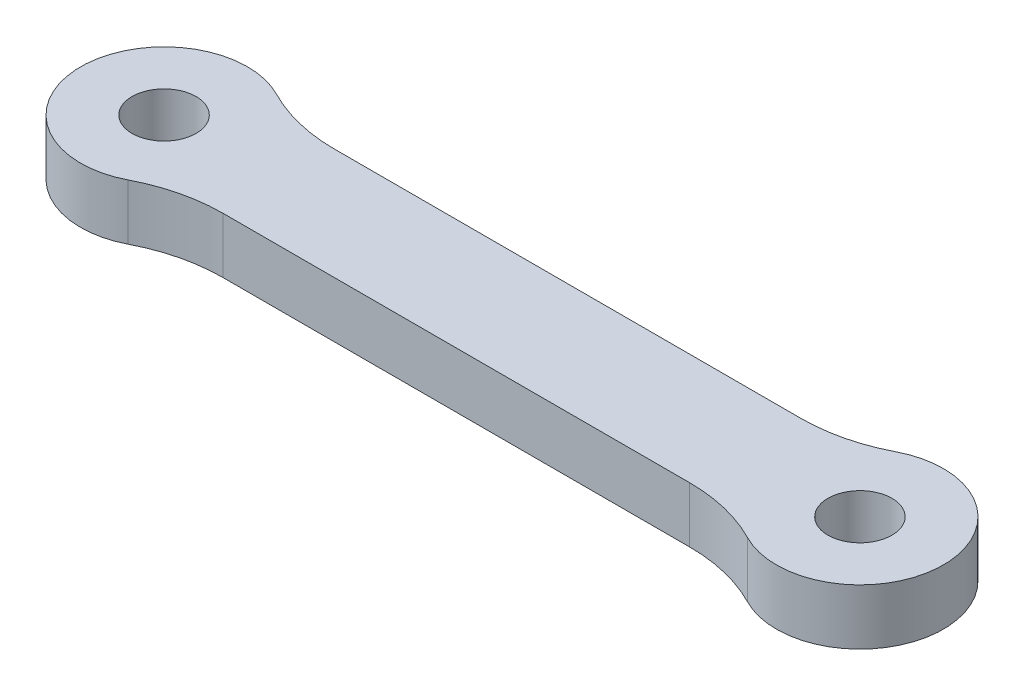
ISO-10303-21;
HEADER;
FILE_DESCRIPTION(('STEP AP214'),'2;1');
FILE_NAME('part.step','',(''),(''),'','','');
FILE_SCHEMA(('AUTOMOTIVE_DESIGN { 1 0 10303 214 1 1 1 1 }'));
ENDSEC;
DATA;
#1=APPLICATION_CONTEXT('core data for automotive mechanical design processes');
#2=APPLICATION_PROTOCOL_DEFINITION('international standard','automotive_design',2000,#1);
#3=PRODUCT_CONTEXT('',#1,'mechanical');
#4=PRODUCT('Part','Part','',(#3));
#5=PRODUCT_RELATED_PRODUCT_CATEGORY('part','',(#4));
#6=PRODUCT_DEFINITION_FORMATION('','',#4);
#7=PRODUCT_DEFINITION_CONTEXT('part definition',#1,'design');
#8=PRODUCT_DEFINITION('design','',#6,#7);
#9=PRODUCT_DEFINITION_SHAPE('','',#8);
#10=(LENGTH_UNIT() NAMED_UNIT(*) SI_UNIT(.MILLI.,.METRE.));
#11=(NAMED_UNIT(*) PLANE_ANGLE_UNIT() SI_UNIT($,.RADIAN.));
#12=(NAMED_UNIT(*) SI_UNIT($,.STERADIAN.) SOLID_ANGLE_UNIT());
#13=UNCERTAINTY_MEASURE_WITH_UNIT(LENGTH_MEASURE(1.E-05),#10,'distance_accuracy_value','');
#14=(GEOMETRIC_REPRESENTATION_CONTEXT(3) GLOBAL_UNCERTAINTY_ASSIGNED_CONTEXT((#13)) GLOBAL_UNIT_ASSIGNED_CONTEXT((#10,
#11,#12)) REPRESENTATION_CONTEXT('',''));
#15=CARTESIAN_POINT('',(0.,0.,0.));
#16=DIRECTION('',(0.,0.,1.));
#17=DIRECTION('',(1.,0.,0.));
#18=AXIS2_PLACEMENT_3D('',#15,#16,#17);
#19=CARTESIAN_POINT('',(0.,2.,2.00000000000001));
#20=DIRECTION('',(0.,0.,1.));
#21=DIRECTION('',(1.,0.,0.));
#22=AXIS2_PLACEMENT_3D('',#19,#20,#21);
#23=PLANE('',#22);
#24=DIRECTION('',(-1.,0.,0.));
#25=VECTOR('',#24,1.);
#26=CARTESIAN_POINT('',(0.,0.,2.00000000000001));
#27=LINE('',#26,#25);
#28=CARTESIAN_POINT('',(20.8768943743823,0.,2.));
#29=VERTEX_POINT('',#28);
#30=CARTESIAN_POINT('',(4.12310562561765,0.,2.));
#31=VERTEX_POINT('',#30);
#32=EDGE_CURVE('E166',#29,#31,#27,.T.);
#33=ORIENTED_EDGE('',*,*,#32,.F.);
#34=DIRECTION('',(0.,-1.,0.));
#35=VECTOR('',#34,1.);
#36=CARTESIAN_POINT('',(20.8768943743823,2.,2.));
#37=LINE('',#36,#35);
#38=CARTESIAN_POINT('',(20.8768943743823,2.,2.));
#39=VERTEX_POINT('',#38);
#40=EDGE_CURVE('E135',#29,#39,#37,.F.);
#41=ORIENTED_EDGE('',*,*,#40,.T.);
#42=DIRECTION('',(-1.,0.,0.));
#43=VECTOR('',#42,1.);
#44=CARTESIAN_POINT('',(0.,2.,2.00000000000001));
#45=LINE('',#44,#43);
#46=CARTESIAN_POINT('',(4.12310562561765,2.,2.));
#47=VERTEX_POINT('',#46);
#48=EDGE_CURVE('E154',#39,#47,#45,.T.);
#49=ORIENTED_EDGE('',*,*,#48,.T.);
#50=DIRECTION('',(0.,-1.,0.));
#51=VECTOR('',#50,1.);
#52=CARTESIAN_POINT('',(4.12310562561765,2.,2.));
#53=LINE('',#52,#51);
#54=EDGE_CURVE('E132',#47,#31,#53,.T.);
#55=ORIENTED_EDGE('',*,*,#54,.T.);
#56=EDGE_LOOP('',(#33,#41,#49,#55));
#57=FACE_BOUND('',#56,.T.);
#58=ADVANCED_FACE('F36',(#57),#23,.T.);
#59=CARTESIAN_POINT('',(25.,2.,0.));
#60=DIRECTION('',(0.,-1.,0.));
#61=DIRECTION('',(0.,0.,-1.));
#62=AXIS2_PLACEMENT_3D('',#59,#60,#61);
#63=CYLINDRICAL_SURFACE('',#62,3.);
#64=CARTESIAN_POINT('',(25.,0.,0.));
#65=DIRECTION('',(0.,1.,0.));
#66=DIRECTION('',(0.,0.,1.));
#67=AXIS2_PLACEMENT_3D('',#64,#65,#66);
#68=CIRCLE('',#67,3.);
#69=CARTESIAN_POINT('',(23.6256314581274,0.,2.66666666666667));
#70=VERTEX_POINT('',#69);
#71=CARTESIAN_POINT('',(23.6256314581274,0.,-2.66666666666667));
#72=VERTEX_POINT('',#71);
#73=EDGE_CURVE('E118',#70,#72,#68,.T.);
#74=ORIENTED_EDGE('',*,*,#73,.T.);
#75=DIRECTION('',(0.,-1.,0.));
#76=VECTOR('',#75,1.);
#77=CARTESIAN_POINT('',(23.6256314581274,2.,-2.66666666666667));
#78=LINE('',#77,#76);
#79=CARTESIAN_POINT('',(23.6256314581274,2.,-2.66666666666667));
#80=VERTEX_POINT('',#79);
#81=EDGE_CURVE('E130',#72,#80,#78,.F.);
#82=ORIENTED_EDGE('',*,*,#81,.T.);
#83=CARTESIAN_POINT('',(25.,2.,0.));
#84=DIRECTION('',(0.,1.,0.));
#85=DIRECTION('',(0.,0.,1.));
#86=AXIS2_PLACEMENT_3D('',#83,#84,#85);
#87=CIRCLE('',#86,3.);
#88=CARTESIAN_POINT('',(23.6256314581274,2.,2.66666666666667));
#89=VERTEX_POINT('',#88);
#90=EDGE_CURVE('E162',#89,#80,#87,.T.);
#91=ORIENTED_EDGE('',*,*,#90,.F.);
#92=DIRECTION('',(0.,-1.,0.));
#93=VECTOR('',#92,1.);
#94=CARTESIAN_POINT('',(23.6256314581274,2.,2.66666666666667));
#95=LINE('',#94,#93);
#96=EDGE_CURVE('E122',#89,#70,#95,.T.);
#97=ORIENTED_EDGE('',*,*,#96,.T.);
#98=EDGE_LOOP('',(#74,#82,#91,#97));
#99=FACE_BOUND('',#98,.T.);
#100=ADVANCED_FACE('F189',(#99),#63,.T.);
#101=CARTESIAN_POINT('',(0.,2.,-2.));
#102=DIRECTION('',(0.,0.,-1.));
#103=DIRECTION('',(-1.,0.,0.));
#104=AXIS2_PLACEMENT_3D('',#101,#102,#103);
#105=PLANE('',#104);
#106=DIRECTION('',(1.,0.,0.));
#107=VECTOR('',#106,1.);
#108=CARTESIAN_POINT('',(0.,2.,-2.));
#109=LINE('',#108,#107);
#110=CARTESIAN_POINT('',(4.12310562561766,2.,-2.));
#111=VERTEX_POINT('',#110);
#112=CARTESIAN_POINT('',(20.8768943743823,2.,-2.));
#113=VERTEX_POINT('',#112);
#114=EDGE_CURVE('E124',#111,#113,#109,.T.);
#115=ORIENTED_EDGE('',*,*,#114,.T.);
#116=DIRECTION('',(0.,-1.,0.));
#117=VECTOR('',#116,1.);
#118=CARTESIAN_POINT('',(20.8768943743823,2.,-2.));
#119=LINE('',#118,#117);
#120=CARTESIAN_POINT('',(20.8768943743823,0.,-2.));
#121=VERTEX_POINT('',#120);
#122=EDGE_CURVE('E117',#113,#121,#119,.T.);
#123=ORIENTED_EDGE('',*,*,#122,.T.);
#124=DIRECTION('',(1.,0.,0.));
#125=VECTOR('',#124,1.);
#126=CARTESIAN_POINT('',(0.,0.,-2.));
#127=LINE('',#126,#125);
#128=CARTESIAN_POINT('',(4.12310562561766,0.,-2.));
#129=VERTEX_POINT('',#128);
#130=EDGE_CURVE('E104',#129,#121,#127,.T.);
#131=ORIENTED_EDGE('',*,*,#130,.F.);
#132=DIRECTION('',(0.,-1.,0.));
#133=VECTOR('',#132,1.);
#134=CARTESIAN_POINT('',(4.12310562561766,2.,-2.));
#135=LINE('',#134,#133);
#136=EDGE_CURVE('E115',#129,#111,#135,.F.);
#137=ORIENTED_EDGE('',*,*,#136,.T.);
#138=EDGE_LOOP('',(#115,#123,#131,#137));
#139=FACE_BOUND('',#138,.T.);
#140=ADVANCED_FACE('F114',(#139),#105,.T.);
#141=CARTESIAN_POINT('',(0.,2.,0.));
#142=DIRECTION('',(0.,-1.,0.));
#143=DIRECTION('',(0.,0.,-1.));
#144=AXIS2_PLACEMENT_3D('',#141,#142,#143);
#145=CYLINDRICAL_SURFACE('',#144,1.15);
#146=CARTESIAN_POINT('',(0.,2.,0.));
#147=DIRECTION('',(0.,1.,0.));
#148=DIRECTION('',(0.,0.,1.));
#149=AXIS2_PLACEMENT_3D('',#146,#147,#148);
#150=CIRCLE('',#149,1.15);
#151=CARTESIAN_POINT('',(0.,2.,1.15));
#152=VERTEX_POINT('',#151);
#153=EDGE_CURVE('E163',#152,#152,#150,.T.);
#154=ORIENTED_EDGE('',*,*,#153,.T.);
#155=EDGE_LOOP('',(#154));
#156=FACE_BOUND('',#155,.T.);
#157=CARTESIAN_POINT('',(0.,0.,0.));
#158=DIRECTION('',(0.,1.,0.));
#159=DIRECTION('',(0.,0.,1.));
#160=AXIS2_PLACEMENT_3D('',#157,#158,#159);
#161=CIRCLE('',#160,1.15);
#162=CARTESIAN_POINT('',(0.,0.,1.15));
#163=VERTEX_POINT('',#162);
#164=EDGE_CURVE('E182',#163,#163,#161,.T.);
#165=ORIENTED_EDGE('',*,*,#164,.F.);
#166=EDGE_LOOP('',(#165));
#167=FACE_BOUND('',#166,.T.);
#168=ADVANCED_FACE('F212',(#156,#167),#145,.F.);
#169=CARTESIAN_POINT('',(25.,2.,0.));
#170=DIRECTION('',(0.,-1.,0.));
#171=DIRECTION('',(0.,0.,-1.));
#172=AXIS2_PLACEMENT_3D('',#169,#170,#171);
#173=CYLINDRICAL_SURFACE('',#172,1.15);
#174=CARTESIAN_POINT('',(25.,2.,0.));
#175=DIRECTION('',(0.,1.,0.));
#176=DIRECTION('',(0.,0.,1.));
#177=AXIS2_PLACEMENT_3D('',#174,#175,#176);
#178=CIRCLE('',#177,1.15);
#179=CARTESIAN_POINT('',(25.,2.,1.15));
#180=VERTEX_POINT('',#179);
#181=EDGE_CURVE('E168',#180,#180,#178,.T.);
#182=ORIENTED_EDGE('',*,*,#181,.T.);
#183=EDGE_LOOP('',(#182));
#184=FACE_BOUND('',#183,.T.);
#185=CARTESIAN_POINT('',(25.,0.,0.));
#186=DIRECTION('',(0.,1.,0.));
#187=DIRECTION('',(0.,0.,1.));
#188=AXIS2_PLACEMENT_3D('',#185,#186,#187);
#189=CIRCLE('',#188,1.15);
#190=CARTESIAN_POINT('',(25.,0.,1.15));
#191=VERTEX_POINT('',#190);
#192=EDGE_CURVE('E179',#191,#191,#189,.T.);
#193=ORIENTED_EDGE('',*,*,#192,.F.);
#194=EDGE_LOOP('',(#193));
#195=FACE_BOUND('',#194,.T.);
#196=ADVANCED_FACE('F215',(#184,#195),#173,.F.);
#197=CARTESIAN_POINT('',(0.,2.,0.));
#198=DIRECTION('',(0.,-1.,0.));
#199=DIRECTION('',(0.,0.,-1.));
#200=AXIS2_PLACEMENT_3D('',#197,#198,#199);
#201=CYLINDRICAL_SURFACE('',#200,3.);
#202=CARTESIAN_POINT('',(0.,0.,0.));
#203=DIRECTION('',(0.,1.,0.));
#204=DIRECTION('',(0.,0.,1.));
#205=AXIS2_PLACEMENT_3D('',#202,#203,#204);
#206=CIRCLE('',#205,3.);
#207=CARTESIAN_POINT('',(1.37436854187255,0.,-2.66666666666667));
#208=VERTEX_POINT('',#207);
#209=CARTESIAN_POINT('',(1.37436854187255,0.,2.66666666666667));
#210=VERTEX_POINT('',#209);
#211=EDGE_CURVE('E105',#208,#210,#206,.T.);
#212=ORIENTED_EDGE('',*,*,#211,.T.);
#213=DIRECTION('',(0.,-1.,0.));
#214=VECTOR('',#213,1.);
#215=CARTESIAN_POINT('',(1.37436854187255,2.,2.66666666666667));
#216=LINE('',#215,#214);
#217=CARTESIAN_POINT('',(1.37436854187255,2.,2.66666666666667));
#218=VERTEX_POINT('',#217);
#219=EDGE_CURVE('E51',#210,#218,#216,.F.);
#220=ORIENTED_EDGE('',*,*,#219,.T.);
#221=CARTESIAN_POINT('',(0.,2.,0.));
#222=DIRECTION('',(0.,1.,0.));
#223=DIRECTION('',(0.,0.,1.));
#224=AXIS2_PLACEMENT_3D('',#221,#222,#223);
#225=CIRCLE('',#224,3.);
#226=CARTESIAN_POINT('',(1.37436854187255,2.,-2.66666666666667));
#227=VERTEX_POINT('',#226);
#228=EDGE_CURVE('E120',#227,#218,#225,.T.);
#229=ORIENTED_EDGE('',*,*,#228,.F.);
#230=DIRECTION('',(0.,-1.,0.));
#231=VECTOR('',#230,1.);
#232=CARTESIAN_POINT('',(1.37436854187255,2.,-2.66666666666667));
#233=LINE('',#232,#231);
#234=EDGE_CURVE('E137',#227,#208,#233,.T.);
#235=ORIENTED_EDGE('',*,*,#234,.T.);
#236=EDGE_LOOP('',(#212,#220,#229,#235));
#237=FACE_BOUND('',#236,.T.);
#238=ADVANCED_FACE('F167',(#237),#201,.T.);
#239=CARTESIAN_POINT('',(0.,2.,0.));
#240=DIRECTION('',(0.,1.,0.));
#241=DIRECTION('',(0.,0.,1.));
#242=AXIS2_PLACEMENT_3D('',#239,#240,#241);
#243=PLANE('',#242);
#244=ORIENTED_EDGE('',*,*,#181,.F.);
#245=EDGE_LOOP('',(#244));
#246=FACE_BOUND('',#245,.T.);
#247=ORIENTED_EDGE('',*,*,#153,.F.);
#248=EDGE_LOOP('',(#247));
#249=FACE_BOUND('',#248,.T.);
#250=ORIENTED_EDGE('',*,*,#48,.F.);
#251=CARTESIAN_POINT('',(20.8768943743823,2.,8.));
#252=DIRECTION('',(0.,1.,0.));
#253=DIRECTION('',(0.,0.,1.));
#254=AXIS2_PLACEMENT_3D('',#251,#252,#253);
#255=CIRCLE('',#254,6.);
#256=EDGE_CURVE('E146',#39,#89,#255,.F.);
#257=ORIENTED_EDGE('',*,*,#256,.T.);
#258=ORIENTED_EDGE('',*,*,#90,.T.);
#259=CARTESIAN_POINT('',(20.8768943743823,2.,-8.));
#260=DIRECTION('',(0.,1.,0.));
#261=DIRECTION('',(0.,0.,1.));
#262=AXIS2_PLACEMENT_3D('',#259,#260,#261);
#263=CIRCLE('',#262,6.);
#264=EDGE_CURVE('E142',#80,#113,#263,.F.);
#265=ORIENTED_EDGE('',*,*,#264,.T.);
#266=ORIENTED_EDGE('',*,*,#114,.F.);
#267=CARTESIAN_POINT('',(4.12310562561766,2.,-8.));
#268=DIRECTION('',(0.,1.,0.));
#269=DIRECTION('',(0.,0.,1.));
#270=AXIS2_PLACEMENT_3D('',#267,#268,#269);
#271=CIRCLE('',#270,6.);
#272=EDGE_CURVE('E11',#111,#227,#271,.F.);
#273=ORIENTED_EDGE('',*,*,#272,.T.);
#274=ORIENTED_EDGE('',*,*,#228,.T.);
#275=CARTESIAN_POINT('',(4.12310562561765,2.,8.));
#276=DIRECTION('',(0.,1.,0.));
#277=DIRECTION('',(0.,0.,1.));
#278=AXIS2_PLACEMENT_3D('',#275,#276,#277);
#279=CIRCLE('',#278,6.);
#280=EDGE_CURVE('E110',#218,#47,#279,.F.);
#281=ORIENTED_EDGE('',*,*,#280,.T.);
#282=EDGE_LOOP('',(#250,#257,#258,#265,#266,#273,#274,#281));
#283=FACE_BOUND('',#282,.T.);
#284=ADVANCED_FACE('F153',(#246,#249,#283),#243,.T.);
#285=CARTESIAN_POINT('',(0.,0.,0.));
#286=DIRECTION('',(0.,1.,0.));
#287=DIRECTION('',(0.,0.,1.));
#288=AXIS2_PLACEMENT_3D('',#285,#286,#287);
#289=PLANE('',#288);
#290=ORIENTED_EDGE('',*,*,#192,.T.);
#291=EDGE_LOOP('',(#290));
#292=FACE_BOUND('',#291,.T.);
#293=ORIENTED_EDGE('',*,*,#164,.T.);
#294=EDGE_LOOP('',(#293));
#295=FACE_BOUND('',#294,.T.);
#296=ORIENTED_EDGE('',*,*,#73,.F.);
#297=CARTESIAN_POINT('',(20.8768943743823,0.,8.));
#298=DIRECTION('',(0.,1.,0.));
#299=DIRECTION('',(0.,0.,1.));
#300=AXIS2_PLACEMENT_3D('',#297,#298,#299);
#301=CIRCLE('',#300,6.);
#302=EDGE_CURVE('E144',#70,#29,#301,.T.);
#303=ORIENTED_EDGE('',*,*,#302,.T.);
#304=ORIENTED_EDGE('',*,*,#32,.T.);
#305=CARTESIAN_POINT('',(4.12310562561765,0.,8.));
#306=DIRECTION('',(0.,1.,0.));
#307=DIRECTION('',(0.,0.,1.));
#308=AXIS2_PLACEMENT_3D('',#305,#306,#307);
#309=CIRCLE('',#308,6.);
#310=EDGE_CURVE('E148',#31,#210,#309,.T.);
#311=ORIENTED_EDGE('',*,*,#310,.T.);
#312=ORIENTED_EDGE('',*,*,#211,.F.);
#313=CARTESIAN_POINT('',(4.12310562561766,0.,-8.));
#314=DIRECTION('',(0.,1.,0.));
#315=DIRECTION('',(0.,0.,1.));
#316=AXIS2_PLACEMENT_3D('',#313,#314,#315);
#317=CIRCLE('',#316,6.);
#318=EDGE_CURVE('E44',#208,#129,#317,.T.);
#319=ORIENTED_EDGE('',*,*,#318,.T.);
#320=ORIENTED_EDGE('',*,*,#130,.T.);
#321=CARTESIAN_POINT('',(20.8768943743823,0.,-8.));
#322=DIRECTION('',(0.,1.,0.));
#323=DIRECTION('',(0.,0.,1.));
#324=AXIS2_PLACEMENT_3D('',#321,#322,#323);
#325=CIRCLE('',#324,6.);
#326=EDGE_CURVE('E140',#121,#72,#325,.T.);
#327=ORIENTED_EDGE('',*,*,#326,.T.);
#328=EDGE_LOOP('',(#296,#303,#304,#311,#312,#319,#320,#327));
#329=FACE_BOUND('',#328,.T.);
#330=ADVANCED_FACE('F103',(#292,#295,#329),#289,.F.);
#331=CARTESIAN_POINT('',(20.8768943743823,2.,-8.));
#332=DIRECTION('',(0.,-1.,0.));
#333=DIRECTION('',(0.,0.,-1.));
#334=AXIS2_PLACEMENT_3D('',#331,#332,#333);
#335=CYLINDRICAL_SURFACE('',#334,6.);
#336=ORIENTED_EDGE('',*,*,#264,.F.);
#337=ORIENTED_EDGE('',*,*,#81,.F.);
#338=ORIENTED_EDGE('',*,*,#326,.F.);
#339=ORIENTED_EDGE('',*,*,#122,.F.);
#340=EDGE_LOOP('',(#336,#337,#338,#339));
#341=FACE_BOUND('',#340,.T.);
#342=ADVANCED_FACE('F194',(#341),#335,.F.);
#343=CARTESIAN_POINT('',(20.8768943743823,2.,8.));
#344=DIRECTION('',(0.,-1.,0.));
#345=DIRECTION('',(0.,0.,-1.));
#346=AXIS2_PLACEMENT_3D('',#343,#344,#345);
#347=CYLINDRICAL_SURFACE('',#346,6.);
#348=ORIENTED_EDGE('',*,*,#256,.F.);
#349=ORIENTED_EDGE('',*,*,#40,.F.);
#350=ORIENTED_EDGE('',*,*,#302,.F.);
#351=ORIENTED_EDGE('',*,*,#96,.F.);
#352=EDGE_LOOP('',(#348,#349,#350,#351));
#353=FACE_BOUND('',#352,.T.);
#354=ADVANCED_FACE('F196',(#353),#347,.F.);
#355=CARTESIAN_POINT('',(4.12310562561765,2.,8.));
#356=DIRECTION('',(0.,-1.,0.));
#357=DIRECTION('',(0.,0.,-1.));
#358=AXIS2_PLACEMENT_3D('',#355,#356,#357);
#359=CYLINDRICAL_SURFACE('',#358,6.);
#360=ORIENTED_EDGE('',*,*,#280,.F.);
#361=ORIENTED_EDGE('',*,*,#219,.F.);
#362=ORIENTED_EDGE('',*,*,#310,.F.);
#363=ORIENTED_EDGE('',*,*,#54,.F.);
#364=EDGE_LOOP('',(#360,#361,#362,#363));
#365=FACE_BOUND('',#364,.T.);
#366=ADVANCED_FACE('F165',(#365),#359,.F.);
#367=CARTESIAN_POINT('',(4.12310562561766,2.,-8.));
#368=DIRECTION('',(0.,-1.,0.));
#369=DIRECTION('',(0.,0.,-1.));
#370=AXIS2_PLACEMENT_3D('',#367,#368,#369);
#371=CYLINDRICAL_SURFACE('',#370,6.);
#372=ORIENTED_EDGE('',*,*,#272,.F.);
#373=ORIENTED_EDGE('',*,*,#136,.F.);
#374=ORIENTED_EDGE('',*,*,#318,.F.);
#375=ORIENTED_EDGE('',*,*,#234,.F.);
#376=EDGE_LOOP('',(#372,#373,#374,#375));
#377=FACE_BOUND('',#376,.T.);
#378=ADVANCED_FACE('F38',(#377),#371,.F.);
#379=CLOSED_SHELL('',(#58,#100,#140,#168,#196,#238,#284,#330,#342,#354,#366,#378));
#380=MANIFOLD_SOLID_BREP('B2',#379);
#381=ADVANCED_BREP_SHAPE_REPRESENTATION('',(#18,#380),#14);
#382=SHAPE_DEFINITION_REPRESENTATION(#9,#381);
ENDSEC;
END-ISO-10303-21;
